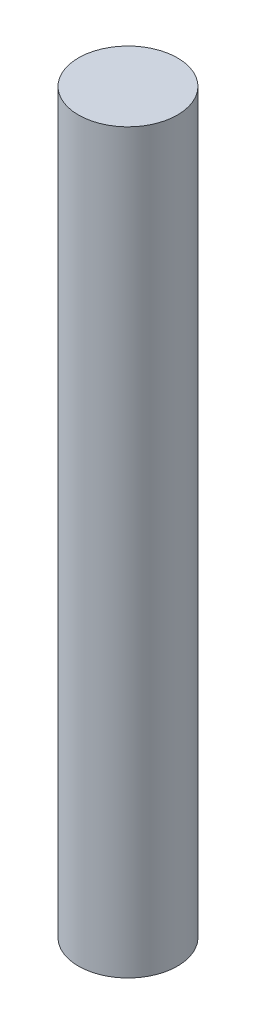
ISO-10303-21;
HEADER;
FILE_DESCRIPTION(('STEP AP214'),'2;1');
FILE_NAME('part.step','',(''),(''),'','','');
FILE_SCHEMA(('AUTOMOTIVE_DESIGN { 1 0 10303 214 1 1 1 1 }'));
ENDSEC;
DATA;
#1=APPLICATION_CONTEXT('core data for automotive mechanical design processes');
#2=APPLICATION_PROTOCOL_DEFINITION('international standard','automotive_design',2000,#1);
#3=PRODUCT_CONTEXT('',#1,'mechanical');
#4=PRODUCT('Part','Part','',(#3));
#5=PRODUCT_RELATED_PRODUCT_CATEGORY('part','',(#4));
#6=PRODUCT_DEFINITION_FORMATION('','',#4);
#7=PRODUCT_DEFINITION_CONTEXT('part definition',#1,'design');
#8=PRODUCT_DEFINITION('design','',#6,#7);
#9=PRODUCT_DEFINITION_SHAPE('','',#8);
#10=(LENGTH_UNIT() NAMED_UNIT(*) SI_UNIT(.MILLI.,.METRE.));
#11=(NAMED_UNIT(*) PLANE_ANGLE_UNIT() SI_UNIT($,.RADIAN.));
#12=(NAMED_UNIT(*) SI_UNIT($,.STERADIAN.) SOLID_ANGLE_UNIT());
#13=UNCERTAINTY_MEASURE_WITH_UNIT(LENGTH_MEASURE(1.E-05),#10,'distance_accuracy_value','');
#14=(GEOMETRIC_REPRESENTATION_CONTEXT(3) GLOBAL_UNCERTAINTY_ASSIGNED_CONTEXT((#13)) GLOBAL_UNIT_ASSIGNED_CONTEXT((#10,
#11,#12)) REPRESENTATION_CONTEXT('',''));
#15=CARTESIAN_POINT('',(0.,0.,0.));
#16=DIRECTION('',(0.,0.,1.));
#17=DIRECTION('',(1.,0.,0.));
#18=AXIS2_PLACEMENT_3D('',#15,#16,#17);
#19=CARTESIAN_POINT('',(-36.32616565727,67.,-11.3461302558035));
#20=DIRECTION('',(0.,-1.,0.));
#21=DIRECTION('',(0.,0.,-1.));
#22=AXIS2_PLACEMENT_3D('',#19,#20,#21);
#23=CYLINDRICAL_SURFACE('',#22,4.5);
#24=CARTESIAN_POINT('',(-36.32616565727,67.,-11.3461302558035));
#25=DIRECTION('',(0.,1.,0.));
#26=DIRECTION('',(0.,0.,1.));
#27=AXIS2_PLACEMENT_3D('',#24,#25,#26);
#28=CIRCLE('',#27,4.5);
#29=CARTESIAN_POINT('',(-36.32616565727,67.,-6.84613025580347));
#30=VERTEX_POINT('',#29);
#31=EDGE_CURVE('E10',#30,#30,#28,.T.);
#32=ORIENTED_EDGE('',*,*,#31,.F.);
#33=EDGE_LOOP('',(#32));
#34=FACE_BOUND('',#33,.T.);
#35=CARTESIAN_POINT('',(-36.32616565727,0.,-11.3461302558035));
#36=DIRECTION('',(0.,1.,0.));
#37=DIRECTION('',(0.,0.,1.));
#38=AXIS2_PLACEMENT_3D('',#35,#36,#37);
#39=CIRCLE('',#38,4.5);
#40=CARTESIAN_POINT('',(-36.32616565727,0.,-6.84613025580347));
#41=VERTEX_POINT('',#40);
#42=EDGE_CURVE('E34',#41,#41,#39,.T.);
#43=ORIENTED_EDGE('',*,*,#42,.T.);
#44=EDGE_LOOP('',(#43));
#45=FACE_BOUND('',#44,.T.);
#46=ADVANCED_FACE('F31',(#34,#45),#23,.T.);
#47=CARTESIAN_POINT('',(-36.32616565727,67.,-11.3461302558035));
#48=DIRECTION('',(0.,1.,0.));
#49=DIRECTION('',(0.,0.,1.));
#50=AXIS2_PLACEMENT_3D('',#47,#48,#49);
#51=PLANE('',#50);
#52=ORIENTED_EDGE('',*,*,#31,.T.);
#53=EDGE_LOOP('',(#52));
#54=FACE_BOUND('',#53,.T.);
#55=ADVANCED_FACE('F46',(#54),#51,.T.);
#56=CARTESIAN_POINT('',(-36.32616565727,0.,-11.3461302558035));
#57=DIRECTION('',(0.,1.,0.));
#58=DIRECTION('',(0.,0.,1.));
#59=AXIS2_PLACEMENT_3D('',#56,#57,#58);
#60=PLANE('',#59);
#61=ORIENTED_EDGE('',*,*,#42,.F.);
#62=EDGE_LOOP('',(#61));
#63=FACE_BOUND('',#62,.T.);
#64=ADVANCED_FACE('F44',(#63),#60,.F.);
#65=CLOSED_SHELL('',(#46,#55,#64));
#66=MANIFOLD_SOLID_BREP('B2',#65);
#67=ADVANCED_BREP_SHAPE_REPRESENTATION('',(#18,#66),#14);
#68=SHAPE_DEFINITION_REPRESENTATION(#9,#67);
ENDSEC;
END-ISO-10303-21;
